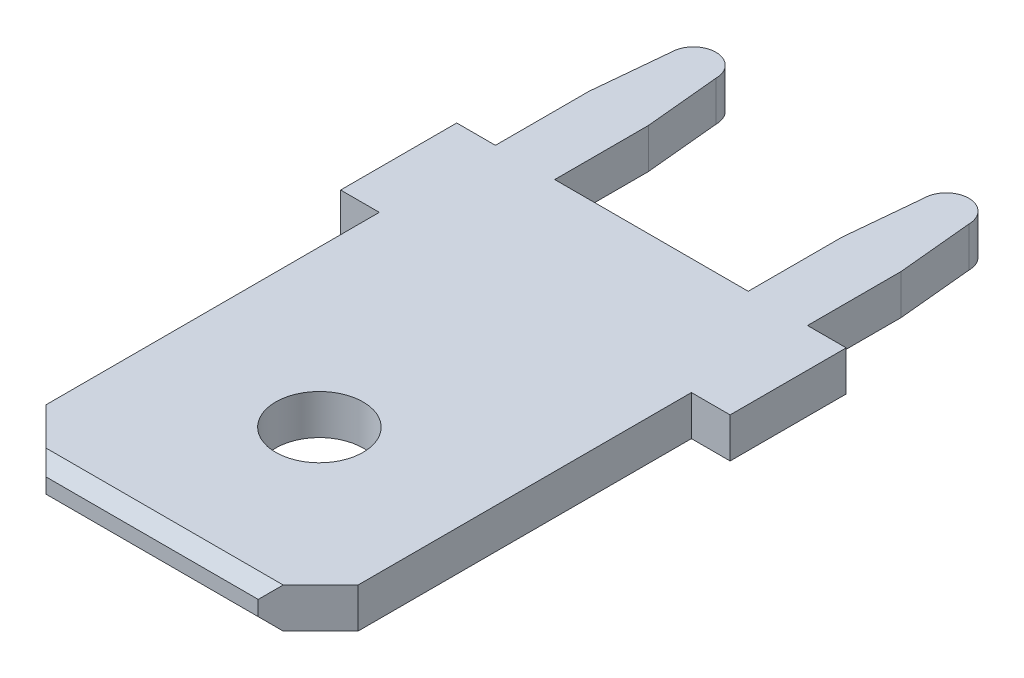
ISO-10303-21;
HEADER;
FILE_DESCRIPTION(('STEP AP214'),'2;1');
FILE_NAME('part.step','',(''),(''),'','','');
FILE_SCHEMA(('AUTOMOTIVE_DESIGN { 1 0 10303 214 1 1 1 1 }'));
ENDSEC;
DATA;
#1=APPLICATION_CONTEXT('core data for automotive mechanical design processes');
#2=APPLICATION_PROTOCOL_DEFINITION('international standard','automotive_design',2000,#1);
#3=PRODUCT_CONTEXT('',#1,'mechanical');
#4=PRODUCT('Part','Part','',(#3));
#5=PRODUCT_RELATED_PRODUCT_CATEGORY('part','',(#4));
#6=PRODUCT_DEFINITION_FORMATION('','',#4);
#7=PRODUCT_DEFINITION_CONTEXT('part definition',#1,'design');
#8=PRODUCT_DEFINITION('design','',#6,#7);
#9=PRODUCT_DEFINITION_SHAPE('','',#8);
#10=(LENGTH_UNIT() NAMED_UNIT(*) SI_UNIT(.MILLI.,.METRE.));
#11=(NAMED_UNIT(*) PLANE_ANGLE_UNIT() SI_UNIT($,.RADIAN.));
#12=(NAMED_UNIT(*) SI_UNIT($,.STERADIAN.) SOLID_ANGLE_UNIT());
#13=UNCERTAINTY_MEASURE_WITH_UNIT(LENGTH_MEASURE(1.E-05),#10,'distance_accuracy_value','');
#14=(GEOMETRIC_REPRESENTATION_CONTEXT(3) GLOBAL_UNCERTAINTY_ASSIGNED_CONTEXT((#13)) GLOBAL_UNIT_ASSIGNED_CONTEXT((#10,
#11,#12)) REPRESENTATION_CONTEXT('',''));
#15=CARTESIAN_POINT('',(0.,0.,0.));
#16=DIRECTION('',(0.,0.,1.));
#17=DIRECTION('',(1.,0.,0.));
#18=AXIS2_PLACEMENT_3D('',#15,#16,#17);
#19=CARTESIAN_POINT('',(30.6809113411884,61.823600492684,6.7691));
#20=DIRECTION('',(0.,1.,0.));
#21=DIRECTION('',(-1.,0.,0.));
#22=AXIS2_PLACEMENT_3D('',#19,#20,#21);
#23=CYLINDRICAL_SURFACE('',#22,0.889);
#24=CARTESIAN_POINT('',(30.6809113411884,61.823600492684,6.7691));
#25=DIRECTION('',(0.,1.,0.));
#26=DIRECTION('',(-1.,0.,0.));
#27=AXIS2_PLACEMENT_3D('',#24,#25,#26);
#28=CIRCLE('',#27,0.889);
#29=CARTESIAN_POINT('',(29.7919113411884,61.823600492684,6.7691));
#30=VERTEX_POINT('',#29);
#31=EDGE_CURVE('E40',#30,#30,#28,.T.);
#32=ORIENTED_EDGE('',*,*,#31,.F.);
#33=EDGE_LOOP('',(#32));
#34=FACE_BOUND('',#33,.T.);
#35=CARTESIAN_POINT('',(30.6809113411884,62.636400492684,6.7691));
#36=DIRECTION('',(0.,-1.,0.));
#37=DIRECTION('',(-1.,0.,0.));
#38=AXIS2_PLACEMENT_3D('',#35,#36,#37);
#39=CIRCLE('',#38,0.889);
#40=CARTESIAN_POINT('',(29.7919113411884,62.636400492684,6.7691));
#41=VERTEX_POINT('',#40);
#42=EDGE_CURVE('E270',#41,#41,#39,.T.);
#43=ORIENTED_EDGE('',*,*,#42,.F.);
#44=EDGE_LOOP('',(#43));
#45=FACE_BOUND('',#44,.T.);
#46=ADVANCED_FACE('F16',(#34,#45),#23,.F.);
#47=CARTESIAN_POINT('',(29.7792113411884,62.509400492684,10.0457));
#48=DIRECTION('',(0.,0.707106781186548,0.707106781186548));
#49=DIRECTION('',(1.,0.,0.));
#50=AXIS2_PLACEMENT_3D('',#47,#48,#49);
#51=PLANE('',#50);
#52=DIRECTION('',(0.577350269189622,-0.577350269189628,0.577350269189627));
#53=VECTOR('',#52,1.);
#54=CARTESIAN_POINT('',(28.2679113411884,62.636400492684,9.9187));
#55=LINE('',#54,#53);
#56=CARTESIAN_POINT('',(28.2679113411884,62.636400492684,9.9187));
#57=VERTEX_POINT('',#56);
#58=CARTESIAN_POINT('',(28.5219113411884,62.382400492684,10.1727));
#59=VERTEX_POINT('',#58);
#60=EDGE_CURVE('E11',#57,#59,#55,.T.);
#61=ORIENTED_EDGE('',*,*,#60,.T.);
#62=DIRECTION('',(1.,0.,0.));
#63=VECTOR('',#62,1.);
#64=CARTESIAN_POINT('',(28.5219113411884,62.382400492684,10.1727));
#65=LINE('',#64,#63);
#66=CARTESIAN_POINT('',(32.8399113411884,62.382400492684,10.1727));
#67=VERTEX_POINT('',#66);
#68=EDGE_CURVE('E27',#59,#67,#65,.T.);
#69=ORIENTED_EDGE('',*,*,#68,.T.);
#70=DIRECTION('',(0.577350269189625,0.577350269189627,-0.577350269189625));
#71=VECTOR('',#70,1.);
#72=CARTESIAN_POINT('',(32.8399113411884,62.382400492684,10.1727));
#73=LINE('',#72,#71);
#74=CARTESIAN_POINT('',(33.0939113411884,62.636400492684,9.9187));
#75=VERTEX_POINT('',#74);
#76=EDGE_CURVE('E239',#67,#75,#73,.T.);
#77=ORIENTED_EDGE('',*,*,#76,.T.);
#78=DIRECTION('',(-1.,0.,0.));
#79=VECTOR('',#78,1.);
#80=CARTESIAN_POINT('',(33.0939113411884,62.636400492684,9.9187));
#81=LINE('',#80,#79);
#82=EDGE_CURVE('E243',#75,#57,#81,.T.);
#83=ORIENTED_EDGE('',*,*,#82,.T.);
#84=EDGE_LOOP('',(#61,#69,#77,#83));
#85=FACE_BOUND('',#84,.T.);
#86=ADVANCED_FACE('F782',(#85),#51,.T.);
#87=CARTESIAN_POINT('',(33.8559113411884,61.823600492684,9.1567));
#88=DIRECTION('',(0.707106781186548,0.,0.707106781186548));
#89=DIRECTION('',(0.,-1.,0.));
#90=AXIS2_PLACEMENT_3D('',#87,#88,#89);
#91=PLANE('',#90);
#92=ORIENTED_EDGE('',*,*,#76,.F.);
#93=DIRECTION('',(0.,1.,0.));
#94=VECTOR('',#93,1.);
#95=CARTESIAN_POINT('',(32.8399113411884,62.0776004926844,10.1727));
#96=LINE('',#95,#94);
#97=CARTESIAN_POINT('',(32.8399113411884,62.0776004926844,10.1727));
#98=VERTEX_POINT('',#97);
#99=EDGE_CURVE('E312',#98,#67,#96,.T.);
#100=ORIENTED_EDGE('',*,*,#99,.F.);
#101=DIRECTION('',(-0.577350269189625,0.577350269189627,0.577350269189625));
#102=VECTOR('',#101,1.);
#103=CARTESIAN_POINT('',(33.0939113411884,61.823600492684,9.9187));
#104=LINE('',#103,#102);
#105=CARTESIAN_POINT('',(33.0939113411884,61.823600492684,9.9187));
#106=VERTEX_POINT('',#105);
#107=EDGE_CURVE('E206',#106,#98,#104,.T.);
#108=ORIENTED_EDGE('',*,*,#107,.F.);
#109=DIRECTION('',(-0.707106781186548,0.,0.707106781186548));
#110=VECTOR('',#109,1.);
#111=CARTESIAN_POINT('',(33.8559113411884,61.823600492684,9.1567));
#112=LINE('',#111,#110);
#113=CARTESIAN_POINT('',(33.8559113411884,61.823600492684,9.1567));
#114=VERTEX_POINT('',#113);
#115=EDGE_CURVE('E210',#114,#106,#112,.T.);
#116=ORIENTED_EDGE('',*,*,#115,.F.);
#117=DIRECTION('',(0.,1.,0.));
#118=VECTOR('',#117,1.);
#119=CARTESIAN_POINT('',(33.8559113411884,61.823600492684,9.1567));
#120=LINE('',#119,#118);
#121=CARTESIAN_POINT('',(33.8559113411884,62.636400492684,9.1567));
#122=VERTEX_POINT('',#121);
#123=EDGE_CURVE('E279',#114,#122,#120,.T.);
#124=ORIENTED_EDGE('',*,*,#123,.T.);
#125=DIRECTION('',(-0.707106781186548,0.,0.707106781186548));
#126=VECTOR('',#125,1.);
#127=CARTESIAN_POINT('',(33.8559113411884,62.636400492684,9.1567));
#128=LINE('',#127,#126);
#129=EDGE_CURVE('E308',#122,#75,#128,.T.);
#130=ORIENTED_EDGE('',*,*,#129,.T.);
#131=EDGE_LOOP('',(#92,#100,#108,#116,#124,#130));
#132=FACE_BOUND('',#131,.T.);
#133=ADVANCED_FACE('F723',(#132),#91,.T.);
#134=CARTESIAN_POINT('',(32.8399113411884,61.823600492684,10.1727));
#135=DIRECTION('',(0.,0.,1.));
#136=DIRECTION('',(1.,0.,0.));
#137=AXIS2_PLACEMENT_3D('',#134,#135,#136);
#138=PLANE('',#137);
#139=ORIENTED_EDGE('',*,*,#68,.F.);
#140=DIRECTION('',(0.,1.,0.));
#141=VECTOR('',#140,1.);
#142=CARTESIAN_POINT('',(28.5219113411884,62.0776004926844,10.1727));
#143=LINE('',#142,#141);
#144=CARTESIAN_POINT('',(28.5219113411884,62.0776004926844,10.1727));
#145=VERTEX_POINT('',#144);
#146=EDGE_CURVE('E212',#145,#59,#143,.T.);
#147=ORIENTED_EDGE('',*,*,#146,.F.);
#148=DIRECTION('',(-1.,0.,0.));
#149=VECTOR('',#148,1.);
#150=CARTESIAN_POINT('',(32.8399113411884,62.0776004926844,10.1727));
#151=LINE('',#150,#149);
#152=EDGE_CURVE('E313',#98,#145,#151,.T.);
#153=ORIENTED_EDGE('',*,*,#152,.F.);
#154=ORIENTED_EDGE('',*,*,#99,.T.);
#155=EDGE_LOOP('',(#139,#147,#153,#154));
#156=FACE_BOUND('',#155,.T.);
#157=ADVANCED_FACE('F717',(#156),#138,.T.);
#158=CARTESIAN_POINT('',(30.3824613411884,61.9506004926844,10.0457));
#159=DIRECTION('',(0.,-0.707106781186548,0.707106781186548));
#160=DIRECTION('',(-1.,0.,0.));
#161=AXIS2_PLACEMENT_3D('',#158,#159,#160);
#162=PLANE('',#161);
#163=DIRECTION('',(-0.577350269189626,-0.577350269189627,-0.577350269189626));
#164=VECTOR('',#163,1.);
#165=CARTESIAN_POINT('',(28.5219113411884,62.0776004926844,10.1727));
#166=LINE('',#165,#164);
#167=CARTESIAN_POINT('',(28.2679113411884,61.823600492684,9.9187));
#168=VERTEX_POINT('',#167);
#169=EDGE_CURVE('E275',#145,#168,#166,.T.);
#170=ORIENTED_EDGE('',*,*,#169,.T.);
#171=DIRECTION('',(1.,0.,0.));
#172=VECTOR('',#171,1.);
#173=CARTESIAN_POINT('',(28.2679113411884,61.823600492684,9.9187));
#174=LINE('',#173,#172);
#175=EDGE_CURVE('E271',#168,#106,#174,.T.);
#176=ORIENTED_EDGE('',*,*,#175,.T.);
#177=ORIENTED_EDGE('',*,*,#107,.T.);
#178=ORIENTED_EDGE('',*,*,#152,.T.);
#179=EDGE_LOOP('',(#170,#176,#177,#178));
#180=FACE_BOUND('',#179,.T.);
#181=ADVANCED_FACE('F722',(#180),#162,.T.);
#182=CARTESIAN_POINT('',(27.5059113411884,61.823600492684,-1.88976));
#183=DIRECTION('',(-0.995439375853015,0.,-0.0953962735192515));
#184=DIRECTION('',(-0.0953962735192515,0.,0.995439375853015));
#185=AXIS2_PLACEMENT_3D('',#182,#183,#184);
#186=PLANE('',#185);
#187=DIRECTION('',(0.095396273519253,0.,-0.995439375853015));
#188=VECTOR('',#187,1.);
#189=CARTESIAN_POINT('',(27.5059113411884,62.636400492684,-1.88976));
#190=LINE('',#189,#188);
#191=CARTESIAN_POINT('',(27.5059113411884,62.636400492684,-1.88976));
#192=VERTEX_POINT('',#191);
#193=CARTESIAN_POINT('',(27.6519613411884,62.636400492684,-3.41376));
#194=VERTEX_POINT('',#193);
#195=EDGE_CURVE('E317',#192,#194,#190,.T.);
#196=ORIENTED_EDGE('',*,*,#195,.T.);
#197=DIRECTION('',(0.,1.,0.));
#198=VECTOR('',#197,1.);
#199=CARTESIAN_POINT('',(27.6519613411884,61.823600492684,-3.41376));
#200=LINE('',#199,#198);
#201=CARTESIAN_POINT('',(27.6519613411884,61.823600492684,-3.41376));
#202=VERTEX_POINT('',#201);
#203=EDGE_CURVE('E332',#202,#194,#200,.T.);
#204=ORIENTED_EDGE('',*,*,#203,.F.);
#205=DIRECTION('',(0.095396273519253,0.,-0.995439375853015));
#206=VECTOR('',#205,1.);
#207=CARTESIAN_POINT('',(27.5059113411884,61.823600492684,-1.88976));
#208=LINE('',#207,#206);
#209=CARTESIAN_POINT('',(27.5059113411884,61.823600492684,-1.88976));
#210=VERTEX_POINT('',#209);
#211=EDGE_CURVE('E175',#210,#202,#208,.T.);
#212=ORIENTED_EDGE('',*,*,#211,.F.);
#213=DIRECTION('',(0.,1.,0.));
#214=VECTOR('',#213,1.);
#215=CARTESIAN_POINT('',(27.5059113411884,61.823600492684,-1.88976));
#216=LINE('',#215,#214);
#217=EDGE_CURVE('E331',#210,#192,#216,.T.);
#218=ORIENTED_EDGE('',*,*,#217,.T.);
#219=EDGE_LOOP('',(#196,#204,#212,#218));
#220=FACE_BOUND('',#219,.T.);
#221=ADVANCED_FACE('F671',(#220),#186,.T.);
#222=CARTESIAN_POINT('',(28.1091613411884,61.823600492684,-3.41376));
#223=DIRECTION('',(0.,1.,0.));
#224=DIRECTION('',(-1.,0.,0.));
#225=AXIS2_PLACEMENT_3D('',#222,#223,#224);
#226=CYLINDRICAL_SURFACE('',#225,0.4572);
#227=CARTESIAN_POINT('',(28.1091613411884,62.636400492684,-3.41376));
#228=DIRECTION('',(0.,-1.,0.));
#229=DIRECTION('',(-1.,0.,0.));
#230=AXIS2_PLACEMENT_3D('',#227,#228,#229);
#231=CIRCLE('',#230,0.4572);
#232=CARTESIAN_POINT('',(28.5663613411884,62.636400492684,-3.41376));
#233=VERTEX_POINT('',#232);
#234=EDGE_CURVE('E184',#194,#233,#231,.T.);
#235=ORIENTED_EDGE('',*,*,#234,.T.);
#236=DIRECTION('',(0.,1.,0.));
#237=VECTOR('',#236,1.);
#238=CARTESIAN_POINT('',(28.5663613411884,61.823600492684,-3.41376));
#239=LINE('',#238,#237);
#240=CARTESIAN_POINT('',(28.5663613411884,61.823600492684,-3.41376));
#241=VERTEX_POINT('',#240);
#242=EDGE_CURVE('E181',#241,#233,#239,.T.);
#243=ORIENTED_EDGE('',*,*,#242,.F.);
#244=CARTESIAN_POINT('',(28.1091613411884,61.823600492684,-3.41376));
#245=DIRECTION('',(0.,-1.,0.));
#246=DIRECTION('',(-1.,0.,0.));
#247=AXIS2_PLACEMENT_3D('',#244,#245,#246);
#248=CIRCLE('',#247,0.4572);
#249=EDGE_CURVE('E164',#202,#241,#248,.T.);
#250=ORIENTED_EDGE('',*,*,#249,.F.);
#251=ORIENTED_EDGE('',*,*,#203,.T.);
#252=EDGE_LOOP('',(#235,#243,#250,#251));
#253=FACE_BOUND('',#252,.T.);
#254=ADVANCED_FACE('F182',(#253),#226,.T.);
#255=CARTESIAN_POINT('',(28.5663613411884,61.823600492684,-3.41376));
#256=DIRECTION('',(0.995431817371145,0.,-0.0954751117578738));
#257=DIRECTION('',(0.,-1.,0.));
#258=AXIS2_PLACEMENT_3D('',#255,#256,#257);
#259=PLANE('',#258);
#260=DIRECTION('',(0.095475111757875,0.,0.995431817371145));
#261=VECTOR('',#260,1.);
#262=CARTESIAN_POINT('',(28.5663613411884,62.636400492684,-3.41376));
#263=LINE('',#262,#261);
#264=CARTESIAN_POINT('',(28.7124113411884,62.636400492684,-1.89103));
#265=VERTEX_POINT('',#264);
#266=EDGE_CURVE('E189',#233,#265,#263,.T.);
#267=ORIENTED_EDGE('',*,*,#266,.T.);
#268=DIRECTION('',(0.,1.,0.));
#269=VECTOR('',#268,1.);
#270=CARTESIAN_POINT('',(28.7124113411884,61.823600492684,-1.89103));
#271=LINE('',#270,#269);
#272=CARTESIAN_POINT('',(28.7124113411884,61.823600492684,-1.89103));
#273=VERTEX_POINT('',#272);
#274=EDGE_CURVE('E193',#273,#265,#271,.T.);
#275=ORIENTED_EDGE('',*,*,#274,.F.);
#276=DIRECTION('',(0.095475111757875,0.,0.995431817371145));
#277=VECTOR('',#276,1.);
#278=CARTESIAN_POINT('',(28.5663613411884,61.823600492684,-3.41376));
#279=LINE('',#278,#277);
#280=EDGE_CURVE('E171',#241,#273,#279,.T.);
#281=ORIENTED_EDGE('',*,*,#280,.F.);
#282=ORIENTED_EDGE('',*,*,#242,.T.);
#283=EDGE_LOOP('',(#267,#275,#281,#282));
#284=FACE_BOUND('',#283,.T.);
#285=ADVANCED_FACE('F192',(#284),#259,.T.);
#286=CARTESIAN_POINT('',(28.7124113411884,61.823600492684,-1.89103));
#287=DIRECTION('',(1.,0.,0.));
#288=DIRECTION('',(0.,1.,0.));
#289=AXIS2_PLACEMENT_3D('',#286,#287,#288);
#290=PLANE('',#289);
#291=DIRECTION('',(0.,0.,1.));
#292=VECTOR('',#291,1.);
#293=CARTESIAN_POINT('',(28.7124113411884,62.636400492684,-1.89103));
#294=LINE('',#293,#292);
#295=CARTESIAN_POINT('',(28.7124113411884,62.636400492684,0.0127000000000019));
#296=VERTEX_POINT('',#295);
#297=EDGE_CURVE('E190',#265,#296,#294,.T.);
#298=ORIENTED_EDGE('',*,*,#297,.T.);
#299=DIRECTION('',(0.,1.,0.));
#300=VECTOR('',#299,1.);
#301=CARTESIAN_POINT('',(28.7124113411884,61.823600492684,0.0127000000000019));
#302=LINE('',#301,#300);
#303=CARTESIAN_POINT('',(28.7124113411884,61.823600492684,0.0127000000000019));
#304=VERTEX_POINT('',#303);
#305=EDGE_CURVE('E222',#304,#296,#302,.T.);
#306=ORIENTED_EDGE('',*,*,#305,.F.);
#307=DIRECTION('',(0.,0.,1.));
#308=VECTOR('',#307,1.);
#309=CARTESIAN_POINT('',(28.7124113411884,61.823600492684,-1.89103));
#310=LINE('',#309,#308);
#311=EDGE_CURVE('E196',#273,#304,#310,.T.);
#312=ORIENTED_EDGE('',*,*,#311,.F.);
#313=ORIENTED_EDGE('',*,*,#274,.T.);
#314=EDGE_LOOP('',(#298,#306,#312,#313));
#315=FACE_BOUND('',#314,.T.);
#316=ADVANCED_FACE('F681',(#315),#290,.T.);
#317=CARTESIAN_POINT('',(28.7124113411884,61.823600492684,0.0127000000000019));
#318=DIRECTION('',(0.,0.,-1.));
#319=DIRECTION('',(0.,-1.,0.));
#320=AXIS2_PLACEMENT_3D('',#317,#318,#319);
#321=PLANE('',#320);
#322=DIRECTION('',(1.,0.,0.));
#323=VECTOR('',#322,1.);
#324=CARTESIAN_POINT('',(28.7124113411884,62.636400492684,0.0127000000000019));
#325=LINE('',#324,#323);
#326=CARTESIAN_POINT('',(32.6494113411884,62.636400492684,0.0127000000000033));
#327=VERTEX_POINT('',#326);
#328=EDGE_CURVE('E302',#296,#327,#325,.T.);
#329=ORIENTED_EDGE('',*,*,#328,.T.);
#330=DIRECTION('',(0.,1.,0.));
#331=VECTOR('',#330,1.);
#332=CARTESIAN_POINT('',(32.6494113411884,61.823600492684,0.0127000000000033));
#333=LINE('',#332,#331);
#334=CARTESIAN_POINT('',(32.6494113411884,61.823600492684,0.0127000000000033));
#335=VERTEX_POINT('',#334);
#336=EDGE_CURVE('E223',#335,#327,#333,.T.);
#337=ORIENTED_EDGE('',*,*,#336,.F.);
#338=DIRECTION('',(1.,0.,0.));
#339=VECTOR('',#338,1.);
#340=CARTESIAN_POINT('',(28.7124113411884,61.823600492684,0.0127000000000019));
#341=LINE('',#340,#339);
#342=EDGE_CURVE('E202',#304,#335,#341,.T.);
#343=ORIENTED_EDGE('',*,*,#342,.F.);
#344=ORIENTED_EDGE('',*,*,#305,.T.);
#345=EDGE_LOOP('',(#329,#337,#343,#344));
#346=FACE_BOUND('',#345,.T.);
#347=ADVANCED_FACE('F592',(#346),#321,.T.);
#348=CARTESIAN_POINT('',(32.6494113411884,61.823600492684,0.0127000000000033));
#349=DIRECTION('',(-1.,0.,0.));
#350=DIRECTION('',(0.,0.,1.));
#351=AXIS2_PLACEMENT_3D('',#348,#349,#350);
#352=PLANE('',#351);
#353=DIRECTION('',(0.,0.,-1.));
#354=VECTOR('',#353,1.);
#355=CARTESIAN_POINT('',(32.6494113411884,62.636400492684,0.0127000000000033));
#356=LINE('',#355,#354);
#357=CARTESIAN_POINT('',(32.6494113411884,62.636400492684,-1.89103));
#358=VERTEX_POINT('',#357);
#359=EDGE_CURVE('E218',#327,#358,#356,.T.);
#360=ORIENTED_EDGE('',*,*,#359,.T.);
#361=DIRECTION('',(0.,1.,0.));
#362=VECTOR('',#361,1.);
#363=CARTESIAN_POINT('',(32.6494113411884,61.823600492684,-1.89103));
#364=LINE('',#363,#362);
#365=CARTESIAN_POINT('',(32.6494113411884,61.823600492684,-1.89103));
#366=VERTEX_POINT('',#365);
#367=EDGE_CURVE('E258',#366,#358,#364,.T.);
#368=ORIENTED_EDGE('',*,*,#367,.F.);
#369=DIRECTION('',(0.,0.,-1.));
#370=VECTOR('',#369,1.);
#371=CARTESIAN_POINT('',(32.6494113411884,61.823600492684,0.0127000000000033));
#372=LINE('',#371,#370);
#373=EDGE_CURVE('E20',#335,#366,#372,.T.);
#374=ORIENTED_EDGE('',*,*,#373,.F.);
#375=ORIENTED_EDGE('',*,*,#336,.T.);
#376=EDGE_LOOP('',(#360,#368,#374,#375));
#377=FACE_BOUND('',#376,.T.);
#378=ADVANCED_FACE('F18',(#377),#352,.T.);
#379=CARTESIAN_POINT('',(32.6494113411884,61.823600492684,-1.89103));
#380=DIRECTION('',(-0.995431817371145,0.,-0.0954751117578838));
#381=DIRECTION('',(-0.0954751117578838,0.,0.995431817371145));
#382=AXIS2_PLACEMENT_3D('',#379,#380,#381);
#383=PLANE('',#382);
#384=DIRECTION('',(0.0954751117578837,0.,-0.995431817371145));
#385=VECTOR('',#384,1.);
#386=CARTESIAN_POINT('',(32.6494113411884,62.636400492684,-1.89103));
#387=LINE('',#386,#385);
#388=CARTESIAN_POINT('',(32.7954613411884,62.636400492684,-3.41376));
#389=VERTEX_POINT('',#388);
#390=EDGE_CURVE('E254',#358,#389,#387,.T.);
#391=ORIENTED_EDGE('',*,*,#390,.T.);
#392=DIRECTION('',(0.,1.,0.));
#393=VECTOR('',#392,1.);
#394=CARTESIAN_POINT('',(32.7954613411884,61.823600492684,-3.41376));
#395=LINE('',#394,#393);
#396=CARTESIAN_POINT('',(32.7954613411884,61.823600492684,-3.41376));
#397=VERTEX_POINT('',#396);
#398=EDGE_CURVE('E283',#397,#389,#395,.T.);
#399=ORIENTED_EDGE('',*,*,#398,.F.);
#400=DIRECTION('',(0.0954751117578837,0.,-0.995431817371145));
#401=VECTOR('',#400,1.);
#402=CARTESIAN_POINT('',(32.6494113411884,61.823600492684,-1.89103));
#403=LINE('',#402,#401);
#404=EDGE_CURVE('E259',#366,#397,#403,.T.);
#405=ORIENTED_EDGE('',*,*,#404,.F.);
#406=ORIENTED_EDGE('',*,*,#367,.T.);
#407=EDGE_LOOP('',(#391,#399,#405,#406));
#408=FACE_BOUND('',#407,.T.);
#409=ADVANCED_FACE('F591',(#408),#383,.T.);
#410=CARTESIAN_POINT('',(33.2526613411884,61.823600492684,-3.41376));
#411=DIRECTION('',(0.,1.,0.));
#412=DIRECTION('',(-1.,0.,0.));
#413=AXIS2_PLACEMENT_3D('',#410,#411,#412);
#414=CYLINDRICAL_SURFACE('',#413,0.4572);
#415=CARTESIAN_POINT('',(33.2526613411884,62.636400492684,-3.41376));
#416=DIRECTION('',(0.,-1.,0.));
#417=DIRECTION('',(-1.,0.,0.));
#418=AXIS2_PLACEMENT_3D('',#415,#416,#417);
#419=CIRCLE('',#418,0.4572);
#420=CARTESIAN_POINT('',(33.7098613411884,62.636400492684,-3.41376));
#421=VERTEX_POINT('',#420);
#422=EDGE_CURVE('E320',#389,#421,#419,.T.);
#423=ORIENTED_EDGE('',*,*,#422,.T.);
#424=DIRECTION('',(0.,1.,0.));
#425=VECTOR('',#424,1.);
#426=CARTESIAN_POINT('',(33.7098613411884,61.823600492684,-3.41376));
#427=LINE('',#426,#425);
#428=CARTESIAN_POINT('',(33.7098613411884,61.823600492684,-3.41376));
#429=VERTEX_POINT('',#428);
#430=EDGE_CURVE('E224',#429,#421,#427,.T.);
#431=ORIENTED_EDGE('',*,*,#430,.F.);
#432=CARTESIAN_POINT('',(33.2526613411884,61.823600492684,-3.41376));
#433=DIRECTION('',(0.,-1.,0.));
#434=DIRECTION('',(-1.,0.,0.));
#435=AXIS2_PLACEMENT_3D('',#432,#433,#434);
#436=CIRCLE('',#435,0.4572);
#437=EDGE_CURVE('E262',#397,#429,#436,.T.);
#438=ORIENTED_EDGE('',*,*,#437,.F.);
#439=ORIENTED_EDGE('',*,*,#398,.T.);
#440=EDGE_LOOP('',(#423,#431,#438,#439));
#441=FACE_BOUND('',#440,.T.);
#442=ADVANCED_FACE('F606',(#441),#414,.T.);
#443=CARTESIAN_POINT('',(33.7098613411884,61.823600492684,-3.41376));
#444=DIRECTION('',(0.995431817371145,0.,-0.0954751117578838));
#445=DIRECTION('',(0.,-1.,0.));
#446=AXIS2_PLACEMENT_3D('',#443,#444,#445);
#447=PLANE('',#446);
#448=DIRECTION('',(0.0954751117578822,0.,0.995431817371145));
#449=VECTOR('',#448,1.);
#450=CARTESIAN_POINT('',(33.7098613411884,62.636400492684,-3.41376));
#451=LINE('',#450,#449);
#452=CARTESIAN_POINT('',(33.8559113411884,62.636400492684,-1.89103));
#453=VERTEX_POINT('',#452);
#454=EDGE_CURVE('E228',#421,#453,#451,.T.);
#455=ORIENTED_EDGE('',*,*,#454,.T.);
#456=DIRECTION('',(0.,1.,0.));
#457=VECTOR('',#456,1.);
#458=CARTESIAN_POINT('',(33.8559113411884,61.823600492684,-1.89103));
#459=LINE('',#458,#457);
#460=CARTESIAN_POINT('',(33.8559113411884,61.823600492684,-1.89103));
#461=VERTEX_POINT('',#460);
#462=EDGE_CURVE('E247',#461,#453,#459,.T.);
#463=ORIENTED_EDGE('',*,*,#462,.F.);
#464=DIRECTION('',(0.0954751117578822,0.,0.995431817371145));
#465=VECTOR('',#464,1.);
#466=CARTESIAN_POINT('',(33.7098613411884,61.823600492684,-3.41376));
#467=LINE('',#466,#465);
#468=EDGE_CURVE('E328',#429,#461,#467,.T.);
#469=ORIENTED_EDGE('',*,*,#468,.F.);
#470=ORIENTED_EDGE('',*,*,#430,.T.);
#471=EDGE_LOOP('',(#455,#463,#469,#470));
#472=FACE_BOUND('',#471,.T.);
#473=ADVANCED_FACE('F795',(#472),#447,.T.);
#474=CARTESIAN_POINT('',(33.8559113411884,61.823600492684,-1.89103));
#475=DIRECTION('',(1.,0.,0.));
#476=DIRECTION('',(0.,1.,0.));
#477=AXIS2_PLACEMENT_3D('',#474,#475,#476);
#478=PLANE('',#477);
#479=DIRECTION('',(0.,0.,1.));
#480=VECTOR('',#479,1.);
#481=CARTESIAN_POINT('',(33.8559113411884,62.636400492684,-1.89103));
#482=LINE('',#481,#480);
#483=CARTESIAN_POINT('',(33.8559113411884,62.636400492684,0.0127000000000011));
#484=VERTEX_POINT('',#483);
#485=EDGE_CURVE('E229',#453,#484,#482,.T.);
#486=ORIENTED_EDGE('',*,*,#485,.T.);
#487=DIRECTION('',(0.,1.,0.));
#488=VECTOR('',#487,1.);
#489=CARTESIAN_POINT('',(33.8559113411884,61.823600492684,0.0127000000000011));
#490=LINE('',#489,#488);
#491=CARTESIAN_POINT('',(33.8559113411884,61.823600492684,0.0127000000000011));
#492=VERTEX_POINT('',#491);
#493=EDGE_CURVE('E325',#492,#484,#490,.T.);
#494=ORIENTED_EDGE('',*,*,#493,.F.);
#495=DIRECTION('',(0.,0.,1.));
#496=VECTOR('',#495,1.);
#497=CARTESIAN_POINT('',(33.8559113411884,61.823600492684,-1.89103));
#498=LINE('',#497,#496);
#499=EDGE_CURVE('E233',#461,#492,#498,.T.);
#500=ORIENTED_EDGE('',*,*,#499,.F.);
#501=ORIENTED_EDGE('',*,*,#462,.T.);
#502=EDGE_LOOP('',(#486,#494,#500,#501));
#503=FACE_BOUND('',#502,.T.);
#504=ADVANCED_FACE('F529',(#503),#478,.T.);
#505=CARTESIAN_POINT('',(33.8559113411884,61.823600492684,0.0127000000000011));
#506=DIRECTION('',(0.,0.,-1.));
#507=DIRECTION('',(0.,-1.,0.));
#508=AXIS2_PLACEMENT_3D('',#505,#506,#507);
#509=PLANE('',#508);
#510=DIRECTION('',(1.,0.,0.));
#511=VECTOR('',#510,1.);
#512=CARTESIAN_POINT('',(33.8559113411884,62.636400492684,0.0127000000000011));
#513=LINE('',#512,#511);
#514=CARTESIAN_POINT('',(34.6433113411884,62.636400492684,0.0127000000000011));
#515=VERTEX_POINT('',#514);
#516=EDGE_CURVE('E321',#484,#515,#513,.T.);
#517=ORIENTED_EDGE('',*,*,#516,.T.);
#518=DIRECTION('',(0.,1.,0.));
#519=VECTOR('',#518,1.);
#520=CARTESIAN_POINT('',(34.6433113411884,61.823600492684,0.0127000000000011));
#521=LINE('',#520,#519);
#522=CARTESIAN_POINT('',(34.6433113411884,61.823600492684,0.0127000000000011));
#523=VERTEX_POINT('',#522);
#524=EDGE_CURVE('E354',#523,#515,#521,.T.);
#525=ORIENTED_EDGE('',*,*,#524,.F.);
#526=DIRECTION('',(1.,0.,0.));
#527=VECTOR('',#526,1.);
#528=CARTESIAN_POINT('',(33.8559113411884,61.823600492684,0.0127000000000011));
#529=LINE('',#528,#527);
#530=EDGE_CURVE('E230',#492,#523,#529,.T.);
#531=ORIENTED_EDGE('',*,*,#530,.F.);
#532=ORIENTED_EDGE('',*,*,#493,.T.);
#533=EDGE_LOOP('',(#517,#525,#531,#532));
#534=FACE_BOUND('',#533,.T.);
#535=ADVANCED_FACE('F522',(#534),#509,.T.);
#536=CARTESIAN_POINT('',(34.6433113411884,61.823600492684,0.0127000000000011));
#537=DIRECTION('',(1.,0.,0.));
#538=DIRECTION('',(0.,1.,0.));
#539=AXIS2_PLACEMENT_3D('',#536,#537,#538);
#540=PLANE('',#539);
#541=DIRECTION('',(0.,0.,1.));
#542=VECTOR('',#541,1.);
#543=CARTESIAN_POINT('',(34.6433113411884,62.636400492684,0.0127000000000011));
#544=LINE('',#543,#542);
#545=CARTESIAN_POINT('',(34.6433113411884,62.636400492684,2.3749));
#546=VERTEX_POINT('',#545);
#547=EDGE_CURVE('E350',#515,#546,#544,.T.);
#548=ORIENTED_EDGE('',*,*,#547,.T.);
#549=DIRECTION('',(0.,1.,0.));
#550=VECTOR('',#549,1.);
#551=CARTESIAN_POINT('',(34.6433113411884,61.823600492684,2.3749));
#552=LINE('',#551,#550);
#553=CARTESIAN_POINT('',(34.6433113411884,61.823600492684,2.3749));
#554=VERTEX_POINT('',#553);
#555=EDGE_CURVE('E355',#554,#546,#552,.T.);
#556=ORIENTED_EDGE('',*,*,#555,.F.);
#557=DIRECTION('',(0.,0.,1.));
#558=VECTOR('',#557,1.);
#559=CARTESIAN_POINT('',(34.6433113411884,61.823600492684,0.0127000000000011));
#560=LINE('',#559,#558);
#561=EDGE_CURVE('E234',#523,#554,#560,.T.);
#562=ORIENTED_EDGE('',*,*,#561,.F.);
#563=ORIENTED_EDGE('',*,*,#524,.T.);
#564=EDGE_LOOP('',(#548,#556,#562,#563));
#565=FACE_BOUND('',#564,.T.);
#566=ADVANCED_FACE('F535',(#565),#540,.T.);
#567=CARTESIAN_POINT('',(34.6433113411884,61.823600492684,2.3749));
#568=DIRECTION('',(0.,0.,1.));
#569=DIRECTION('',(1.,0.,0.));
#570=AXIS2_PLACEMENT_3D('',#567,#568,#569);
#571=PLANE('',#570);
#572=DIRECTION('',(-1.,0.,0.));
#573=VECTOR('',#572,1.);
#574=CARTESIAN_POINT('',(34.6433113411884,62.636400492684,2.3749));
#575=LINE('',#574,#573);
#576=CARTESIAN_POINT('',(33.8559113411884,62.636400492684,2.3749));
#577=VERTEX_POINT('',#576);
#578=EDGE_CURVE('E359',#546,#577,#575,.T.);
#579=ORIENTED_EDGE('',*,*,#578,.T.);
#580=DIRECTION('',(0.,1.,0.));
#581=VECTOR('',#580,1.);
#582=CARTESIAN_POINT('',(33.8559113411884,61.823600492684,2.3749));
#583=LINE('',#582,#581);
#584=CARTESIAN_POINT('',(33.8559113411884,61.823600492684,2.3749));
#585=VERTEX_POINT('',#584);
#586=EDGE_CURVE('E238',#585,#577,#583,.T.);
#587=ORIENTED_EDGE('',*,*,#586,.F.);
#588=DIRECTION('',(-1.,0.,0.));
#589=VECTOR('',#588,1.);
#590=CARTESIAN_POINT('',(34.6433113411884,61.823600492684,2.3749));
#591=LINE('',#590,#589);
#592=EDGE_CURVE('E366',#554,#585,#591,.T.);
#593=ORIENTED_EDGE('',*,*,#592,.F.);
#594=ORIENTED_EDGE('',*,*,#555,.T.);
#595=EDGE_LOOP('',(#579,#587,#593,#594));
#596=FACE_BOUND('',#595,.T.);
#597=ADVANCED_FACE('F537',(#596),#571,.T.);
#598=CARTESIAN_POINT('',(33.8559113411884,61.823600492684,2.3749));
#599=DIRECTION('',(1.,0.,0.));
#600=DIRECTION('',(0.,1.,0.));
#601=AXIS2_PLACEMENT_3D('',#598,#599,#600);
#602=PLANE('',#601);
#603=DIRECTION('',(0.,0.,1.));
#604=VECTOR('',#603,1.);
#605=CARTESIAN_POINT('',(33.8559113411884,62.636400492684,2.3749));
#606=LINE('',#605,#604);
#607=EDGE_CURVE('E360',#577,#122,#606,.T.);
#608=ORIENTED_EDGE('',*,*,#607,.T.);
#609=ORIENTED_EDGE('',*,*,#123,.F.);
#610=DIRECTION('',(0.,0.,1.));
#611=VECTOR('',#610,1.);
#612=CARTESIAN_POINT('',(33.8559113411884,61.823600492684,2.3749));
#613=LINE('',#612,#611);
#614=EDGE_CURVE('E293',#585,#114,#613,.T.);
#615=ORIENTED_EDGE('',*,*,#614,.F.);
#616=ORIENTED_EDGE('',*,*,#586,.T.);
#617=EDGE_LOOP('',(#608,#609,#615,#616));
#618=FACE_BOUND('',#617,.T.);
#619=ADVANCED_FACE('F645',(#618),#602,.T.);
#620=CARTESIAN_POINT('',(28.5219113411884,61.823600492684,10.1727));
#621=DIRECTION('',(-0.707106781186548,0.,0.707106781186548));
#622=DIRECTION('',(0.,1.,0.));
#623=AXIS2_PLACEMENT_3D('',#620,#621,#622);
#624=PLANE('',#623);
#625=ORIENTED_EDGE('',*,*,#60,.F.);
#626=DIRECTION('',(-0.707106781186547,0.,-0.707106781186549));
#627=VECTOR('',#626,1.);
#628=CARTESIAN_POINT('',(28.2679113411884,62.636400492684,9.9187));
#629=LINE('',#628,#627);
#630=CARTESIAN_POINT('',(27.5059113411884,62.636400492684,9.1567));
#631=VERTEX_POINT('',#630);
#632=EDGE_CURVE('E216',#57,#631,#629,.T.);
#633=ORIENTED_EDGE('',*,*,#632,.T.);
#634=DIRECTION('',(0.,1.,0.));
#635=VECTOR('',#634,1.);
#636=CARTESIAN_POINT('',(27.5059113411884,61.823600492684,9.1567));
#637=LINE('',#636,#635);
#638=CARTESIAN_POINT('',(27.5059113411884,61.823600492684,9.1567));
#639=VERTEX_POINT('',#638);
#640=EDGE_CURVE('E288',#639,#631,#637,.T.);
#641=ORIENTED_EDGE('',*,*,#640,.F.);
#642=DIRECTION('',(-0.707106781186547,0.,-0.707106781186549));
#643=VECTOR('',#642,1.);
#644=CARTESIAN_POINT('',(28.2679113411884,61.823600492684,9.9187));
#645=LINE('',#644,#643);
#646=EDGE_CURVE('E267',#168,#639,#645,.T.);
#647=ORIENTED_EDGE('',*,*,#646,.F.);
#648=ORIENTED_EDGE('',*,*,#169,.F.);
#649=ORIENTED_EDGE('',*,*,#146,.T.);
#650=EDGE_LOOP('',(#625,#633,#641,#647,#648,#649));
#651=FACE_BOUND('',#650,.T.);
#652=ADVANCED_FACE('F464',(#651),#624,.T.);
#653=CARTESIAN_POINT('',(27.5059113411884,61.823600492684,9.1567));
#654=DIRECTION('',(-1.,0.,0.));
#655=DIRECTION('',(0.,0.,1.));
#656=AXIS2_PLACEMENT_3D('',#653,#654,#655);
#657=PLANE('',#656);
#658=DIRECTION('',(0.,0.,-1.));
#659=VECTOR('',#658,1.);
#660=CARTESIAN_POINT('',(27.5059113411884,62.636400492684,9.1567));
#661=LINE('',#660,#659);
#662=CARTESIAN_POINT('',(27.5059113411884,62.636400492684,2.3749));
#663=VERTEX_POINT('',#662);
#664=EDGE_CURVE('E217',#631,#663,#661,.T.);
#665=ORIENTED_EDGE('',*,*,#664,.T.);
#666=DIRECTION('',(0.,1.,0.));
#667=VECTOR('',#666,1.);
#668=CARTESIAN_POINT('',(27.5059113411884,61.823600492684,2.3749));
#669=LINE('',#668,#667);
#670=CARTESIAN_POINT('',(27.5059113411884,61.823600492684,2.3749));
#671=VERTEX_POINT('',#670);
#672=EDGE_CURVE('E289',#671,#663,#669,.T.);
#673=ORIENTED_EDGE('',*,*,#672,.F.);
#674=DIRECTION('',(0.,0.,-1.));
#675=VECTOR('',#674,1.);
#676=CARTESIAN_POINT('',(27.5059113411884,61.823600492684,9.1567));
#677=LINE('',#676,#675);
#678=EDGE_CURVE('E252',#639,#671,#677,.T.);
#679=ORIENTED_EDGE('',*,*,#678,.F.);
#680=ORIENTED_EDGE('',*,*,#640,.T.);
#681=EDGE_LOOP('',(#665,#673,#679,#680));
#682=FACE_BOUND('',#681,.T.);
#683=ADVANCED_FACE('F457',(#682),#657,.T.);
#684=CARTESIAN_POINT('',(27.5059113411884,61.823600492684,2.3749));
#685=DIRECTION('',(0.,0.,1.));
#686=DIRECTION('',(1.,0.,0.));
#687=AXIS2_PLACEMENT_3D('',#684,#685,#686);
#688=PLANE('',#687);
#689=DIRECTION('',(-1.,0.,0.));
#690=VECTOR('',#689,1.);
#691=CARTESIAN_POINT('',(27.5059113411884,62.636400492684,2.3749));
#692=LINE('',#691,#690);
#693=CARTESIAN_POINT('',(26.7185113411884,62.636400492684,2.3749));
#694=VERTEX_POINT('',#693);
#695=EDGE_CURVE('E284',#663,#694,#692,.T.);
#696=ORIENTED_EDGE('',*,*,#695,.T.);
#697=DIRECTION('',(0.,1.,0.));
#698=VECTOR('',#697,1.);
#699=CARTESIAN_POINT('',(26.7185113411884,61.823600492684,2.3749));
#700=LINE('',#699,#698);
#701=CARTESIAN_POINT('',(26.7185113411884,61.823600492684,2.3749));
#702=VERTEX_POINT('',#701);
#703=EDGE_CURVE('E294',#702,#694,#700,.T.);
#704=ORIENTED_EDGE('',*,*,#703,.F.);
#705=DIRECTION('',(-1.,0.,0.));
#706=VECTOR('',#705,1.);
#707=CARTESIAN_POINT('',(27.5059113411884,61.823600492684,2.3749));
#708=LINE('',#707,#706);
#709=EDGE_CURVE('E248',#671,#702,#708,.T.);
#710=ORIENTED_EDGE('',*,*,#709,.F.);
#711=ORIENTED_EDGE('',*,*,#672,.T.);
#712=EDGE_LOOP('',(#696,#704,#710,#711));
#713=FACE_BOUND('',#712,.T.);
#714=ADVANCED_FACE('F472',(#713),#688,.T.);
#715=CARTESIAN_POINT('',(27.5059113411884,61.823600492684,0.0127000000000011));
#716=DIRECTION('',(-1.,0.,0.));
#717=DIRECTION('',(0.,0.,1.));
#718=AXIS2_PLACEMENT_3D('',#715,#716,#717);
#719=PLANE('',#718);
#720=DIRECTION('',(0.,-1.,0.));
#721=VECTOR('',#720,1.);
#722=CARTESIAN_POINT('',(27.5059113411884,62.636400492684,0.0127000000000011));
#723=LINE('',#722,#721);
#724=CARTESIAN_POINT('',(27.5059113411884,62.636400492684,0.0127000000000011));
#725=VERTEX_POINT('',#724);
#726=CARTESIAN_POINT('',(27.5059113411884,61.823600492684,0.0127000000000011));
#727=VERTEX_POINT('',#726);
#728=EDGE_CURVE('E211',#725,#727,#723,.T.);
#729=ORIENTED_EDGE('',*,*,#728,.F.);
#730=DIRECTION('',(0.,0.,-1.));
#731=VECTOR('',#730,1.);
#732=CARTESIAN_POINT('',(27.5059113411884,62.636400492684,0.0127000000000011));
#733=LINE('',#732,#731);
#734=EDGE_CURVE('E384',#725,#192,#733,.T.);
#735=ORIENTED_EDGE('',*,*,#734,.T.);
#736=ORIENTED_EDGE('',*,*,#217,.F.);
#737=DIRECTION('',(0.,0.,-1.));
#738=VECTOR('',#737,1.);
#739=CARTESIAN_POINT('',(27.5059113411884,61.823600492684,0.0127000000000011));
#740=LINE('',#739,#738);
#741=EDGE_CURVE('E266',#727,#210,#740,.T.);
#742=ORIENTED_EDGE('',*,*,#741,.F.);
#743=EDGE_LOOP('',(#729,#735,#736,#742));
#744=FACE_BOUND('',#743,.T.);
#745=ADVANCED_FACE('F697',(#744),#719,.T.);
#746=CARTESIAN_POINT('',(26.7185113411884,61.823600492684,0.0127000000000011));
#747=DIRECTION('',(-1.,0.,0.));
#748=DIRECTION('',(0.,0.,1.));
#749=AXIS2_PLACEMENT_3D('',#746,#747,#748);
#750=PLANE('',#749);
#751=DIRECTION('',(0.,0.,1.));
#752=VECTOR('',#751,1.);
#753=CARTESIAN_POINT('',(26.7185113411884,62.636400492684,0.0127000000000011));
#754=LINE('',#753,#752);
#755=CARTESIAN_POINT('',(26.7185113411884,62.636400492684,0.0127000000000011));
#756=VERTEX_POINT('',#755);
#757=EDGE_CURVE('E376',#756,#694,#754,.T.);
#758=ORIENTED_EDGE('',*,*,#757,.F.);
#759=DIRECTION('',(0.,-1.,0.));
#760=VECTOR('',#759,1.);
#761=CARTESIAN_POINT('',(26.7185113411884,62.636400492684,0.0127000000000011));
#762=LINE('',#761,#760);
#763=CARTESIAN_POINT('',(26.7185113411884,61.823600492684,0.0127000000000011));
#764=VERTEX_POINT('',#763);
#765=EDGE_CURVE('E412',#756,#764,#762,.T.);
#766=ORIENTED_EDGE('',*,*,#765,.T.);
#767=DIRECTION('',(0.,0.,1.));
#768=VECTOR('',#767,1.);
#769=CARTESIAN_POINT('',(26.7185113411884,61.823600492684,0.0127000000000011));
#770=LINE('',#769,#768);
#771=EDGE_CURVE('E297',#764,#702,#770,.T.);
#772=ORIENTED_EDGE('',*,*,#771,.T.);
#773=ORIENTED_EDGE('',*,*,#703,.T.);
#774=EDGE_LOOP('',(#758,#766,#772,#773));
#775=FACE_BOUND('',#774,.T.);
#776=ADVANCED_FACE('F738',(#775),#750,.T.);
#777=CARTESIAN_POINT('',(26.7185113411884,62.636400492684,0.0127000000000011));
#778=DIRECTION('',(0.,1.,0.));
#779=DIRECTION('',(1.,0.,0.));
#780=AXIS2_PLACEMENT_3D('',#777,#778,#779);
#781=PLANE('',#780);
#782=ORIENTED_EDGE('',*,*,#82,.F.);
#783=ORIENTED_EDGE('',*,*,#129,.F.);
#784=ORIENTED_EDGE('',*,*,#607,.F.);
#785=ORIENTED_EDGE('',*,*,#578,.F.);
#786=ORIENTED_EDGE('',*,*,#547,.F.);
#787=ORIENTED_EDGE('',*,*,#516,.F.);
#788=ORIENTED_EDGE('',*,*,#485,.F.);
#789=ORIENTED_EDGE('',*,*,#454,.F.);
#790=ORIENTED_EDGE('',*,*,#422,.F.);
#791=ORIENTED_EDGE('',*,*,#390,.F.);
#792=ORIENTED_EDGE('',*,*,#359,.F.);
#793=ORIENTED_EDGE('',*,*,#328,.F.);
#794=ORIENTED_EDGE('',*,*,#297,.F.);
#795=ORIENTED_EDGE('',*,*,#266,.F.);
#796=ORIENTED_EDGE('',*,*,#234,.F.);
#797=ORIENTED_EDGE('',*,*,#195,.F.);
#798=ORIENTED_EDGE('',*,*,#734,.F.);
#799=DIRECTION('',(-1.,0.,0.));
#800=VECTOR('',#799,1.);
#801=CARTESIAN_POINT('',(27.5059113411884,62.636400492684,0.0127000000000011));
#802=LINE('',#801,#800);
#803=EDGE_CURVE('E298',#725,#756,#802,.T.);
#804=ORIENTED_EDGE('',*,*,#803,.T.);
#805=ORIENTED_EDGE('',*,*,#757,.T.);
#806=ORIENTED_EDGE('',*,*,#695,.F.);
#807=ORIENTED_EDGE('',*,*,#664,.F.);
#808=ORIENTED_EDGE('',*,*,#632,.F.);
#809=EDGE_LOOP('',(#782,#783,#784,#785,#786,#787,#788,#789,#790,#791,#792,#793,#794,#795,#796,
#797,#798,#804,#805,#806,#807,#808));
#810=FACE_BOUND('',#809,.T.);
#811=ORIENTED_EDGE('',*,*,#42,.T.);
#812=EDGE_LOOP('',(#811));
#813=FACE_BOUND('',#812,.T.);
#814=ADVANCED_FACE('F467',(#810,#813),#781,.T.);
#815=CARTESIAN_POINT('',(27.9250113411884,61.823600492684,0.0127000000000011));
#816=DIRECTION('',(0.,-1.,0.));
#817=DIRECTION('',(0.,0.,-1.));
#818=AXIS2_PLACEMENT_3D('',#815,#816,#817);
#819=PLANE('',#818);
#820=ORIENTED_EDGE('',*,*,#175,.F.);
#821=ORIENTED_EDGE('',*,*,#646,.T.);
#822=ORIENTED_EDGE('',*,*,#678,.T.);
#823=ORIENTED_EDGE('',*,*,#709,.T.);
#824=ORIENTED_EDGE('',*,*,#771,.F.);
#825=DIRECTION('',(1.,0.,0.));
#826=VECTOR('',#825,1.);
#827=CARTESIAN_POINT('',(26.7185113411884,61.823600492684,0.0127000000000011));
#828=LINE('',#827,#826);
#829=EDGE_CURVE('E253',#764,#727,#828,.T.);
#830=ORIENTED_EDGE('',*,*,#829,.T.);
#831=ORIENTED_EDGE('',*,*,#741,.T.);
#832=ORIENTED_EDGE('',*,*,#211,.T.);
#833=ORIENTED_EDGE('',*,*,#249,.T.);
#834=ORIENTED_EDGE('',*,*,#280,.T.);
#835=ORIENTED_EDGE('',*,*,#311,.T.);
#836=ORIENTED_EDGE('',*,*,#342,.T.);
#837=ORIENTED_EDGE('',*,*,#373,.T.);
#838=ORIENTED_EDGE('',*,*,#404,.T.);
#839=ORIENTED_EDGE('',*,*,#437,.T.);
#840=ORIENTED_EDGE('',*,*,#468,.T.);
#841=ORIENTED_EDGE('',*,*,#499,.T.);
#842=ORIENTED_EDGE('',*,*,#530,.T.);
#843=ORIENTED_EDGE('',*,*,#561,.T.);
#844=ORIENTED_EDGE('',*,*,#592,.T.);
#845=ORIENTED_EDGE('',*,*,#614,.T.);
#846=ORIENTED_EDGE('',*,*,#115,.T.);
#847=EDGE_LOOP('',(#820,#821,#822,#823,#824,#830,#831,#832,#833,#834,#835,#836,#837,#838,#839,
#840,#841,#842,#843,#844,#845,#846));
#848=FACE_BOUND('',#847,.T.);
#849=ORIENTED_EDGE('',*,*,#31,.T.);
#850=EDGE_LOOP('',(#849));
#851=FACE_BOUND('',#850,.T.);
#852=ADVANCED_FACE('F167',(#848,#851),#819,.T.);
#853=CARTESIAN_POINT('',(27.3217613411884,62.230000492684,0.0127000000000011));
#854=DIRECTION('',(0.,0.,1.));
#855=DIRECTION('',(1.,0.,0.));
#856=AXIS2_PLACEMENT_3D('',#853,#854,#855);
#857=PLANE('',#856);
#858=ORIENTED_EDGE('',*,*,#728,.T.);
#859=ORIENTED_EDGE('',*,*,#829,.F.);
#860=ORIENTED_EDGE('',*,*,#765,.F.);
#861=ORIENTED_EDGE('',*,*,#803,.F.);
#862=EDGE_LOOP('',(#858,#859,#860,#861));
#863=FACE_BOUND('',#862,.T.);
#864=ADVANCED_FACE('F615',(#863),#857,.F.);
#865=CLOSED_SHELL('',(#46,#86,#133,#157,#181,#221,#254,#285,#316,#347,#378,#409,#442,#473,#504,
#535,#566,#597,#619,#652,#683,#714,#745,#776,#814,#852,#864));
#866=MANIFOLD_SOLID_BREP('B1',#865);
#867=ADVANCED_BREP_SHAPE_REPRESENTATION('',(#18,#866),#14);
#868=SHAPE_DEFINITION_REPRESENTATION(#9,#867);
ENDSEC;
END-ISO-10303-21;
